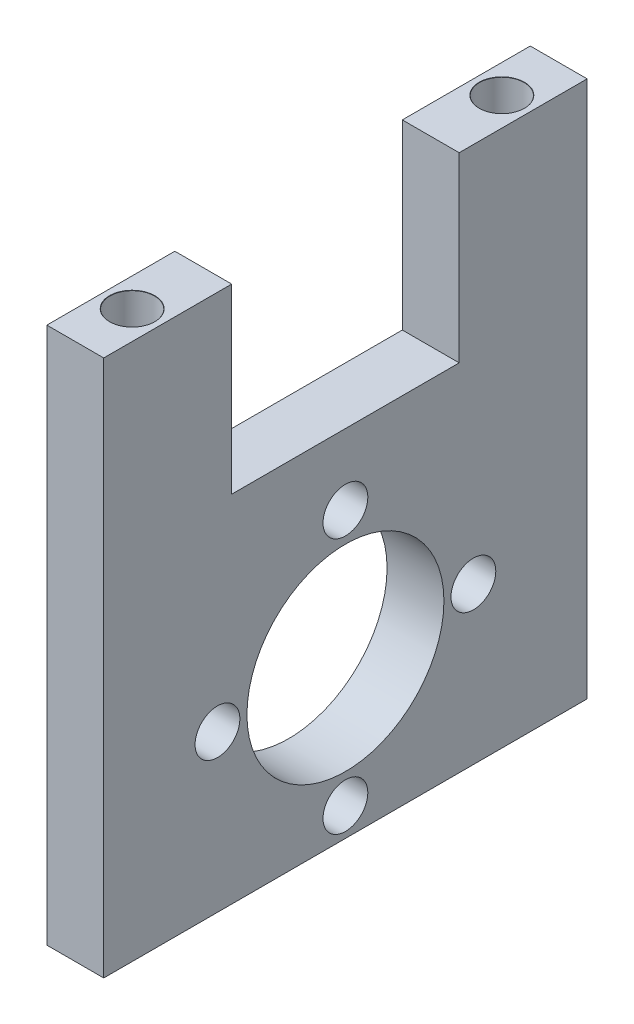
ISO-10303-21;
HEADER;
FILE_DESCRIPTION(('STEP AP214'),'2;1');
FILE_NAME('part.step','',(''),(''),'','','');
FILE_SCHEMA(('AUTOMOTIVE_DESIGN { 1 0 10303 214 1 1 1 1 }'));
ENDSEC;
DATA;
#1=APPLICATION_CONTEXT('core data for automotive mechanical design processes');
#2=APPLICATION_PROTOCOL_DEFINITION('international standard','automotive_design',2000,#1);
#3=PRODUCT_CONTEXT('',#1,'mechanical');
#4=PRODUCT('Part','Part','',(#3));
#5=PRODUCT_RELATED_PRODUCT_CATEGORY('part','',(#4));
#6=PRODUCT_DEFINITION_FORMATION('','',#4);
#7=PRODUCT_DEFINITION_CONTEXT('part definition',#1,'design');
#8=PRODUCT_DEFINITION('design','',#6,#7);
#9=PRODUCT_DEFINITION_SHAPE('','',#8);
#10=(LENGTH_UNIT() NAMED_UNIT(*) SI_UNIT(.MILLI.,.METRE.));
#11=(NAMED_UNIT(*) PLANE_ANGLE_UNIT() SI_UNIT($,.RADIAN.));
#12=(NAMED_UNIT(*) SI_UNIT($,.STERADIAN.) SOLID_ANGLE_UNIT());
#13=UNCERTAINTY_MEASURE_WITH_UNIT(LENGTH_MEASURE(1.E-05),#10,'distance_accuracy_value','');
#14=(GEOMETRIC_REPRESENTATION_CONTEXT(3) GLOBAL_UNCERTAINTY_ASSIGNED_CONTEXT((#13)) GLOBAL_UNIT_ASSIGNED_CONTEXT((#10,
#11,#12)) REPRESENTATION_CONTEXT('',''));
#15=CARTESIAN_POINT('',(0.,0.,0.));
#16=DIRECTION('',(0.,0.,1.));
#17=DIRECTION('',(1.,0.,0.));
#18=AXIS2_PLACEMENT_3D('',#15,#16,#17);
#19=CARTESIAN_POINT('',(193.219917581196,76.2,0.));
#20=DIRECTION('',(0.,-1.,0.));
#21=DIRECTION('',(0.,0.,-1.));
#22=AXIS2_PLACEMENT_3D('',#19,#20,#21);
#23=PLANE('',#22);
#24=DIRECTION('',(0.,0.,-1.));
#25=VECTOR('',#24,1.);
#26=CARTESIAN_POINT('',(199.569917581196,76.2,0.));
#27=LINE('',#26,#25);
#28=CARTESIAN_POINT('',(199.569917581196,76.2,-88.9));
#29=VERTEX_POINT('',#28);
#30=CARTESIAN_POINT('',(199.569917581196,76.2,-114.3));
#31=VERTEX_POINT('',#30);
#32=EDGE_CURVE('E223',#29,#31,#27,.T.);
#33=ORIENTED_EDGE('',*,*,#32,.T.);
#34=DIRECTION('',(1.,0.,0.));
#35=VECTOR('',#34,1.);
#36=CARTESIAN_POINT('',(193.219917581196,76.2,-114.3));
#37=LINE('',#36,#35);
#38=CARTESIAN_POINT('',(193.219917581196,76.2,-114.3));
#39=VERTEX_POINT('',#38);
#40=EDGE_CURVE('E11',#39,#31,#37,.T.);
#41=ORIENTED_EDGE('',*,*,#40,.F.);
#42=DIRECTION('',(0.,0.,-1.));
#43=VECTOR('',#42,1.);
#44=CARTESIAN_POINT('',(193.219917581196,76.2,0.));
#45=LINE('',#44,#43);
#46=CARTESIAN_POINT('',(193.219917581196,76.2,-88.9));
#47=VERTEX_POINT('',#46);
#48=EDGE_CURVE('E66',#47,#39,#45,.T.);
#49=ORIENTED_EDGE('',*,*,#48,.F.);
#50=DIRECTION('',(1.,0.,0.));
#51=VECTOR('',#50,1.);
#52=CARTESIAN_POINT('',(193.219917581196,76.2,-88.9));
#53=LINE('',#52,#51);
#54=EDGE_CURVE('E143',#47,#29,#53,.T.);
#55=ORIENTED_EDGE('',*,*,#54,.T.);
#56=EDGE_LOOP('',(#33,#41,#49,#55));
#57=FACE_BOUND('',#56,.T.);
#58=ADVANCED_FACE('F47',(#57),#23,.F.);
#59=CARTESIAN_POINT('',(193.219917581196,0.,-114.3));
#60=DIRECTION('',(0.,0.,1.));
#61=DIRECTION('',(1.,0.,0.));
#62=AXIS2_PLACEMENT_3D('',#59,#60,#61);
#63=PLANE('',#62);
#64=DIRECTION('',(0.,-1.,0.));
#65=VECTOR('',#64,1.);
#66=CARTESIAN_POINT('',(199.569917581196,0.,-114.3));
#67=LINE('',#66,#65);
#68=CARTESIAN_POINT('',(199.569917581196,96.52,-114.3));
#69=VERTEX_POINT('',#68);
#70=EDGE_CURVE('E156',#69,#31,#67,.T.);
#71=ORIENTED_EDGE('',*,*,#70,.F.);
#72=DIRECTION('',(1.,0.,0.));
#73=VECTOR('',#72,1.);
#74=CARTESIAN_POINT('',(193.219917581196,96.52,-114.3));
#75=LINE('',#74,#73);
#76=CARTESIAN_POINT('',(193.219917581196,96.52,-114.3));
#77=VERTEX_POINT('',#76);
#78=EDGE_CURVE('E57',#77,#69,#75,.T.);
#79=ORIENTED_EDGE('',*,*,#78,.F.);
#80=DIRECTION('',(0.,-1.,0.));
#81=VECTOR('',#80,1.);
#82=CARTESIAN_POINT('',(193.219917581196,0.,-114.3));
#83=LINE('',#82,#81);
#84=EDGE_CURVE('E140',#77,#39,#83,.T.);
#85=ORIENTED_EDGE('',*,*,#84,.T.);
#86=ORIENTED_EDGE('',*,*,#40,.T.);
#87=EDGE_LOOP('',(#71,#79,#85,#86));
#88=FACE_BOUND('',#87,.T.);
#89=ADVANCED_FACE('F282',(#88),#63,.T.);
#90=CARTESIAN_POINT('',(193.219917581196,96.52,0.));
#91=DIRECTION('',(0.,1.,0.));
#92=DIRECTION('',(0.,0.,1.));
#93=AXIS2_PLACEMENT_3D('',#90,#91,#92);
#94=PLANE('',#93);
#95=CARTESIAN_POINT('',(196.394917581196,96.52,-122.2375));
#96=DIRECTION('',(0.,1.,0.));
#97=DIRECTION('',(0.,0.,1.));
#98=AXIS2_PLACEMENT_3D('',#95,#96,#97);
#99=CIRCLE('',#98,2.525);
#100=CARTESIAN_POINT('',(196.394917581196,96.52,-119.7125));
#101=VERTEX_POINT('',#100);
#102=EDGE_CURVE('E190',#101,#101,#99,.T.);
#103=ORIENTED_EDGE('',*,*,#102,.F.);
#104=EDGE_LOOP('',(#103));
#105=FACE_BOUND('',#104,.T.);
#106=DIRECTION('',(0.,0.,1.));
#107=VECTOR('',#106,1.);
#108=CARTESIAN_POINT('',(199.569917581196,96.52,0.));
#109=LINE('',#108,#107);
#110=CARTESIAN_POINT('',(199.569917581196,96.52,-128.5875));
#111=VERTEX_POINT('',#110);
#112=EDGE_CURVE('E127',#111,#69,#109,.T.);
#113=ORIENTED_EDGE('',*,*,#112,.F.);
#114=DIRECTION('',(1.,0.,0.));
#115=VECTOR('',#114,1.);
#116=CARTESIAN_POINT('',(193.219917581196,96.52,-128.5875));
#117=LINE('',#116,#115);
#118=CARTESIAN_POINT('',(193.219917581196,96.52,-128.5875));
#119=VERTEX_POINT('',#118);
#120=EDGE_CURVE('E122',#119,#111,#117,.T.);
#121=ORIENTED_EDGE('',*,*,#120,.F.);
#122=DIRECTION('',(0.,0.,1.));
#123=VECTOR('',#122,1.);
#124=CARTESIAN_POINT('',(193.219917581196,96.52,0.));
#125=LINE('',#124,#123);
#126=EDGE_CURVE('E126',#119,#77,#125,.T.);
#127=ORIENTED_EDGE('',*,*,#126,.T.);
#128=ORIENTED_EDGE('',*,*,#78,.T.);
#129=EDGE_LOOP('',(#113,#121,#127,#128));
#130=FACE_BOUND('',#129,.T.);
#131=ADVANCED_FACE('F124',(#105,#130),#94,.T.);
#132=CARTESIAN_POINT('',(193.219917581196,0.,-128.5875));
#133=DIRECTION('',(0.,0.,1.));
#134=DIRECTION('',(1.,0.,0.));
#135=AXIS2_PLACEMENT_3D('',#132,#133,#134);
#136=PLANE('',#135);
#137=DIRECTION('',(0.,-1.,0.));
#138=VECTOR('',#137,1.);
#139=CARTESIAN_POINT('',(199.569917581196,0.,-128.5875));
#140=LINE('',#139,#138);
#141=CARTESIAN_POINT('',(199.569917581196,36.5632999999999,-128.5875));
#142=VERTEX_POINT('',#141);
#143=EDGE_CURVE('E225',#111,#142,#140,.T.);
#144=ORIENTED_EDGE('',*,*,#143,.T.);
#145=DIRECTION('',(1.,0.,0.));
#146=VECTOR('',#145,1.);
#147=CARTESIAN_POINT('',(193.219917581196,36.5632999999999,-128.5875));
#148=LINE('',#147,#146);
#149=CARTESIAN_POINT('',(193.219917581196,36.5632999999999,-128.5875));
#150=VERTEX_POINT('',#149);
#151=EDGE_CURVE('E130',#150,#142,#148,.T.);
#152=ORIENTED_EDGE('',*,*,#151,.F.);
#153=DIRECTION('',(0.,-1.,0.));
#154=VECTOR('',#153,1.);
#155=CARTESIAN_POINT('',(193.219917581196,0.,-128.5875));
#156=LINE('',#155,#154);
#157=EDGE_CURVE('E133',#119,#150,#156,.T.);
#158=ORIENTED_EDGE('',*,*,#157,.F.);
#159=ORIENTED_EDGE('',*,*,#120,.T.);
#160=EDGE_LOOP('',(#144,#152,#158,#159));
#161=FACE_BOUND('',#160,.T.);
#162=ADVANCED_FACE('F134',(#161),#136,.F.);
#163=CARTESIAN_POINT('',(193.219917581196,36.5632999999999,0.));
#164=DIRECTION('',(0.,1.,0.));
#165=DIRECTION('',(0.,0.,1.));
#166=AXIS2_PLACEMENT_3D('',#163,#164,#165);
#167=PLANE('',#166);
#168=DIRECTION('',(0.,0.,1.));
#169=VECTOR('',#168,1.);
#170=CARTESIAN_POINT('',(199.569917581196,36.5632999999999,0.));
#171=LINE('',#170,#169);
#172=CARTESIAN_POINT('',(199.569917581196,36.5632999999999,-74.6125));
#173=VERTEX_POINT('',#172);
#174=EDGE_CURVE('E221',#142,#173,#171,.T.);
#175=ORIENTED_EDGE('',*,*,#174,.T.);
#176=DIRECTION('',(1.,0.,0.));
#177=VECTOR('',#176,1.);
#178=CARTESIAN_POINT('',(193.219917581196,36.5632999999999,-74.6125));
#179=LINE('',#178,#177);
#180=CARTESIAN_POINT('',(193.219917581196,36.5632999999999,-74.6125));
#181=VERTEX_POINT('',#180);
#182=EDGE_CURVE('E234',#181,#173,#179,.T.);
#183=ORIENTED_EDGE('',*,*,#182,.F.);
#184=DIRECTION('',(0.,0.,1.));
#185=VECTOR('',#184,1.);
#186=CARTESIAN_POINT('',(193.219917581196,36.5632999999999,0.));
#187=LINE('',#186,#185);
#188=EDGE_CURVE('E137',#150,#181,#187,.T.);
#189=ORIENTED_EDGE('',*,*,#188,.F.);
#190=ORIENTED_EDGE('',*,*,#151,.T.);
#191=EDGE_LOOP('',(#175,#183,#189,#190));
#192=FACE_BOUND('',#191,.T.);
#193=ADVANCED_FACE('F270',(#192),#167,.F.);
#194=CARTESIAN_POINT('',(193.219917581196,0.,-74.6125));
#195=DIRECTION('',(0.,0.,1.));
#196=DIRECTION('',(1.,0.,0.));
#197=AXIS2_PLACEMENT_3D('',#194,#195,#196);
#198=PLANE('',#197);
#199=DIRECTION('',(0.,-1.,0.));
#200=VECTOR('',#199,1.);
#201=CARTESIAN_POINT('',(199.569917581196,0.,-74.6125));
#202=LINE('',#201,#200);
#203=CARTESIAN_POINT('',(199.569917581196,96.52,-74.6125));
#204=VERTEX_POINT('',#203);
#205=EDGE_CURVE('E218',#204,#173,#202,.T.);
#206=ORIENTED_EDGE('',*,*,#205,.F.);
#207=DIRECTION('',(1.,0.,0.));
#208=VECTOR('',#207,1.);
#209=CARTESIAN_POINT('',(193.219917581196,96.52,-74.6125));
#210=LINE('',#209,#208);
#211=CARTESIAN_POINT('',(193.219917581196,96.52,-74.6125));
#212=VERTEX_POINT('',#211);
#213=EDGE_CURVE('E213',#212,#204,#210,.T.);
#214=ORIENTED_EDGE('',*,*,#213,.F.);
#215=DIRECTION('',(0.,-1.,0.));
#216=VECTOR('',#215,1.);
#217=CARTESIAN_POINT('',(193.219917581196,0.,-74.6125));
#218=LINE('',#217,#216);
#219=EDGE_CURVE('E148',#212,#181,#218,.T.);
#220=ORIENTED_EDGE('',*,*,#219,.T.);
#221=ORIENTED_EDGE('',*,*,#182,.T.);
#222=EDGE_LOOP('',(#206,#214,#220,#221));
#223=FACE_BOUND('',#222,.T.);
#224=ADVANCED_FACE('F207',(#223),#198,.T.);
#225=CARTESIAN_POINT('',(196.394917581196,96.52,-80.9625));
#226=DIRECTION('',(0.,1.,0.));
#227=DIRECTION('',(0.,0.,1.));
#228=AXIS2_PLACEMENT_3D('',#225,#226,#227);
#229=CIRCLE('',#228,2.525);
#230=CARTESIAN_POINT('',(196.394917581196,96.52,-78.4375));
#231=VERTEX_POINT('',#230);
#232=EDGE_CURVE('E199',#231,#231,#229,.T.);
#233=ORIENTED_EDGE('',*,*,#232,.F.);
#234=EDGE_LOOP('',(#233));
#235=FACE_BOUND('',#234,.T.);
#236=CARTESIAN_POINT('',(199.569917581196,96.52,-88.9));
#237=VERTEX_POINT('',#236);
#238=EDGE_CURVE('E211',#237,#204,#109,.T.);
#239=ORIENTED_EDGE('',*,*,#238,.F.);
#240=DIRECTION('',(1.,0.,0.));
#241=VECTOR('',#240,1.);
#242=CARTESIAN_POINT('',(193.219917581196,96.52,-88.9));
#243=LINE('',#242,#241);
#244=CARTESIAN_POINT('',(193.219917581196,96.52,-88.9));
#245=VERTEX_POINT('',#244);
#246=EDGE_CURVE('E212',#245,#237,#243,.T.);
#247=ORIENTED_EDGE('',*,*,#246,.F.);
#248=EDGE_CURVE('E142',#245,#212,#125,.T.);
#249=ORIENTED_EDGE('',*,*,#248,.T.);
#250=ORIENTED_EDGE('',*,*,#213,.T.);
#251=EDGE_LOOP('',(#239,#247,#249,#250));
#252=FACE_BOUND('',#251,.T.);
#253=ADVANCED_FACE('F205',(#235,#252),#94,.T.);
#254=CARTESIAN_POINT('',(193.219917581196,54.0257999999999,-101.6));
#255=DIRECTION('',(1.,0.,0.));
#256=DIRECTION('',(0.,0.,-1.));
#257=AXIS2_PLACEMENT_3D('',#254,#255,#256);
#258=CYLINDRICAL_SURFACE('',#257,10.9982);
#259=CARTESIAN_POINT('',(193.219917581196,54.0257999999999,-101.6));
#260=DIRECTION('',(1.,0.,0.));
#261=DIRECTION('',(0.,0.,-1.));
#262=AXIS2_PLACEMENT_3D('',#259,#260,#261);
#263=CIRCLE('',#262,10.9982);
#264=CARTESIAN_POINT('',(193.219917581196,54.0257999999999,-112.5982));
#265=VERTEX_POINT('',#264);
#266=EDGE_CURVE('E151',#265,#265,#263,.T.);
#267=ORIENTED_EDGE('',*,*,#266,.F.);
#268=EDGE_LOOP('',(#267));
#269=FACE_BOUND('',#268,.T.);
#270=CARTESIAN_POINT('',(199.569917581196,54.0257999999999,-101.6));
#271=DIRECTION('',(1.,0.,0.));
#272=DIRECTION('',(0.,0.,-1.));
#273=AXIS2_PLACEMENT_3D('',#270,#271,#272);
#274=CIRCLE('',#273,10.9982);
#275=CARTESIAN_POINT('',(199.569917581196,54.0257999999999,-112.5982));
#276=VERTEX_POINT('',#275);
#277=EDGE_CURVE('E242',#276,#276,#274,.T.);
#278=ORIENTED_EDGE('',*,*,#277,.T.);
#279=EDGE_LOOP('',(#278));
#280=FACE_BOUND('',#279,.T.);
#281=ADVANCED_FACE('F49',(#269,#280),#258,.F.);
#282=CARTESIAN_POINT('',(193.219917581196,0.,-88.9));
#283=DIRECTION('',(0.,0.,1.));
#284=DIRECTION('',(1.,0.,0.));
#285=AXIS2_PLACEMENT_3D('',#282,#283,#284);
#286=PLANE('',#285);
#287=DIRECTION('',(0.,-1.,0.));
#288=VECTOR('',#287,1.);
#289=CARTESIAN_POINT('',(199.569917581196,0.,-88.9));
#290=LINE('',#289,#288);
#291=EDGE_CURVE('E219',#237,#29,#290,.T.);
#292=ORIENTED_EDGE('',*,*,#291,.T.);
#293=ORIENTED_EDGE('',*,*,#54,.F.);
#294=DIRECTION('',(0.,-1.,0.));
#295=VECTOR('',#294,1.);
#296=CARTESIAN_POINT('',(193.219917581196,0.,-88.9));
#297=LINE('',#296,#295);
#298=EDGE_CURVE('E106',#245,#47,#297,.T.);
#299=ORIENTED_EDGE('',*,*,#298,.F.);
#300=ORIENTED_EDGE('',*,*,#246,.T.);
#301=EDGE_LOOP('',(#292,#293,#299,#300));
#302=FACE_BOUND('',#301,.T.);
#303=ADVANCED_FACE('F287',(#302),#286,.F.);
#304=CARTESIAN_POINT('',(193.219917581196,0.,0.));
#305=DIRECTION('',(1.,0.,0.));
#306=DIRECTION('',(0.,0.,-1.));
#307=AXIS2_PLACEMENT_3D('',#304,#305,#306);
#308=PLANE('',#307);
#309=CARTESIAN_POINT('',(193.219917581196,68.3132999999999,-101.6));
#310=DIRECTION('',(-1.,0.,0.));
#311=DIRECTION('',(0.,0.,1.));
#312=AXIS2_PLACEMENT_3D('',#309,#310,#311);
#313=CIRCLE('',#312,2.525);
#314=CARTESIAN_POINT('',(193.219917581196,68.3132999999999,-99.075));
#315=VERTEX_POINT('',#314);
#316=EDGE_CURVE('E181',#315,#315,#313,.T.);
#317=ORIENTED_EDGE('',*,*,#316,.F.);
#318=EDGE_LOOP('',(#317));
#319=FACE_BOUND('',#318,.T.);
#320=CARTESIAN_POINT('',(193.219917581196,54.0257999999999,-87.3125));
#321=DIRECTION('',(-1.,0.,0.));
#322=DIRECTION('',(0.,0.,1.));
#323=AXIS2_PLACEMENT_3D('',#320,#321,#322);
#324=CIRCLE('',#323,2.525);
#325=CARTESIAN_POINT('',(193.219917581196,54.0257999999999,-84.7875));
#326=VERTEX_POINT('',#325);
#327=EDGE_CURVE('E175',#326,#326,#324,.T.);
#328=ORIENTED_EDGE('',*,*,#327,.F.);
#329=EDGE_LOOP('',(#328));
#330=FACE_BOUND('',#329,.T.);
#331=CARTESIAN_POINT('',(193.219917581196,39.7382999999999,-101.6));
#332=DIRECTION('',(-1.,0.,0.));
#333=DIRECTION('',(0.,0.,1.));
#334=AXIS2_PLACEMENT_3D('',#331,#332,#333);
#335=CIRCLE('',#334,2.525);
#336=CARTESIAN_POINT('',(193.219917581196,39.7382999999999,-99.075));
#337=VERTEX_POINT('',#336);
#338=EDGE_CURVE('E168',#337,#337,#335,.T.);
#339=ORIENTED_EDGE('',*,*,#338,.F.);
#340=EDGE_LOOP('',(#339));
#341=FACE_BOUND('',#340,.T.);
#342=CARTESIAN_POINT('',(193.219917581196,54.0257999999999,-115.8875));
#343=DIRECTION('',(-1.,0.,0.));
#344=DIRECTION('',(0.,0.,1.));
#345=AXIS2_PLACEMENT_3D('',#342,#343,#344);
#346=CIRCLE('',#345,2.525);
#347=CARTESIAN_POINT('',(193.219917581196,54.0257999999999,-113.3625));
#348=VERTEX_POINT('',#347);
#349=EDGE_CURVE('E161',#348,#348,#346,.T.);
#350=ORIENTED_EDGE('',*,*,#349,.F.);
#351=EDGE_LOOP('',(#350));
#352=FACE_BOUND('',#351,.T.);
#353=ORIENTED_EDGE('',*,*,#266,.T.);
#354=EDGE_LOOP('',(#353));
#355=FACE_BOUND('',#354,.T.);
#356=ORIENTED_EDGE('',*,*,#48,.T.);
#357=ORIENTED_EDGE('',*,*,#84,.F.);
#358=ORIENTED_EDGE('',*,*,#126,.F.);
#359=ORIENTED_EDGE('',*,*,#157,.T.);
#360=ORIENTED_EDGE('',*,*,#188,.T.);
#361=ORIENTED_EDGE('',*,*,#219,.F.);
#362=ORIENTED_EDGE('',*,*,#248,.F.);
#363=ORIENTED_EDGE('',*,*,#298,.T.);
#364=EDGE_LOOP('',(#356,#357,#358,#359,#360,#361,#362,#363));
#365=FACE_BOUND('',#364,.T.);
#366=ADVANCED_FACE('F139',(#319,#330,#341,#352,#355,#365),#308,.F.);
#367=CARTESIAN_POINT('',(199.569917581196,0.,0.));
#368=DIRECTION('',(1.,0.,0.));
#369=DIRECTION('',(0.,0.,-1.));
#370=AXIS2_PLACEMENT_3D('',#367,#368,#369);
#371=PLANE('',#370);
#372=CARTESIAN_POINT('',(199.569917581196,68.3132999999999,-101.6));
#373=DIRECTION('',(1.,0.,0.));
#374=DIRECTION('',(0.,0.,-1.));
#375=AXIS2_PLACEMENT_3D('',#372,#373,#374);
#376=CIRCLE('',#375,2.49999999999999);
#377=CARTESIAN_POINT('',(199.569917581196,68.3132999999999,-104.1));
#378=VERTEX_POINT('',#377);
#379=EDGE_CURVE('E51',#378,#378,#376,.T.);
#380=ORIENTED_EDGE('',*,*,#379,.F.);
#381=EDGE_LOOP('',(#380));
#382=FACE_BOUND('',#381,.T.);
#383=CARTESIAN_POINT('',(199.569917581196,54.0257999999999,-87.3125));
#384=DIRECTION('',(1.,0.,0.));
#385=DIRECTION('',(0.,0.,-1.));
#386=AXIS2_PLACEMENT_3D('',#383,#384,#385);
#387=CIRCLE('',#386,2.49999999999999);
#388=CARTESIAN_POINT('',(199.569917581196,54.0257999999999,-89.8125));
#389=VERTEX_POINT('',#388);
#390=EDGE_CURVE('E171',#389,#389,#387,.T.);
#391=ORIENTED_EDGE('',*,*,#390,.F.);
#392=EDGE_LOOP('',(#391));
#393=FACE_BOUND('',#392,.T.);
#394=CARTESIAN_POINT('',(199.569917581196,39.7382999999999,-101.6));
#395=DIRECTION('',(1.,0.,0.));
#396=DIRECTION('',(0.,0.,-1.));
#397=AXIS2_PLACEMENT_3D('',#394,#395,#396);
#398=CIRCLE('',#397,2.49999999999999);
#399=CARTESIAN_POINT('',(199.569917581196,39.7382999999999,-104.1));
#400=VERTEX_POINT('',#399);
#401=EDGE_CURVE('E164',#400,#400,#398,.T.);
#402=ORIENTED_EDGE('',*,*,#401,.F.);
#403=EDGE_LOOP('',(#402));
#404=FACE_BOUND('',#403,.T.);
#405=CARTESIAN_POINT('',(199.569917581196,54.0257999999999,-115.8875));
#406=DIRECTION('',(1.,0.,0.));
#407=DIRECTION('',(0.,0.,-1.));
#408=AXIS2_PLACEMENT_3D('',#405,#406,#407);
#409=CIRCLE('',#408,2.49999999999999);
#410=CARTESIAN_POINT('',(199.569917581196,54.0257999999999,-118.3875));
#411=VERTEX_POINT('',#410);
#412=EDGE_CURVE('E160',#411,#411,#409,.T.);
#413=ORIENTED_EDGE('',*,*,#412,.F.);
#414=EDGE_LOOP('',(#413));
#415=FACE_BOUND('',#414,.T.);
#416=ORIENTED_EDGE('',*,*,#277,.F.);
#417=EDGE_LOOP('',(#416));
#418=FACE_BOUND('',#417,.T.);
#419=ORIENTED_EDGE('',*,*,#32,.F.);
#420=ORIENTED_EDGE('',*,*,#291,.F.);
#421=ORIENTED_EDGE('',*,*,#238,.T.);
#422=ORIENTED_EDGE('',*,*,#205,.T.);
#423=ORIENTED_EDGE('',*,*,#174,.F.);
#424=ORIENTED_EDGE('',*,*,#143,.F.);
#425=ORIENTED_EDGE('',*,*,#112,.T.);
#426=ORIENTED_EDGE('',*,*,#70,.T.);
#427=EDGE_LOOP('',(#419,#420,#421,#422,#423,#424,#425,#426));
#428=FACE_BOUND('',#427,.T.);
#429=ADVANCED_FACE('F250',(#382,#393,#404,#415,#418,#428),#371,.T.);
#430=CARTESIAN_POINT('',(193.219917581196,54.0257999999999,-115.8875));
#431=DIRECTION('',(-1.,0.,0.));
#432=DIRECTION('',(0.,0.,1.));
#433=AXIS2_PLACEMENT_3D('',#430,#431,#432);
#434=CYLINDRICAL_SURFACE('',#433,2.49999999999999);
#435=ORIENTED_EDGE('',*,*,#412,.T.);
#436=EDGE_LOOP('',(#435));
#437=FACE_BOUND('',#436,.T.);
#438=CARTESIAN_POINT('',(193.244917581196,54.0257999999999,-115.8875));
#439=DIRECTION('',(-1.,0.,0.));
#440=DIRECTION('',(0.,0.,1.));
#441=AXIS2_PLACEMENT_3D('',#438,#439,#440);
#442=CIRCLE('',#441,2.49999999999999);
#443=CARTESIAN_POINT('',(193.244917581196,54.0257999999999,-113.3875));
#444=VERTEX_POINT('',#443);
#445=EDGE_CURVE('E157',#444,#444,#442,.T.);
#446=ORIENTED_EDGE('',*,*,#445,.T.);
#447=EDGE_LOOP('',(#446));
#448=FACE_BOUND('',#447,.T.);
#449=ADVANCED_FACE('F253',(#437,#448),#434,.F.);
#450=CARTESIAN_POINT('',(193.219917581196,54.0257999999999,-115.8875));
#451=DIRECTION('',(-1.,0.,0.));
#452=DIRECTION('',(0.,0.,1.));
#453=AXIS2_PLACEMENT_3D('',#450,#451,#452);
#454=CONICAL_SURFACE('',#453,2.525,0.785398163397726);
#455=ORIENTED_EDGE('',*,*,#445,.F.);
#456=EDGE_LOOP('',(#455));
#457=FACE_BOUND('',#456,.T.);
#458=ORIENTED_EDGE('',*,*,#349,.T.);
#459=EDGE_LOOP('',(#458));
#460=FACE_BOUND('',#459,.T.);
#461=ADVANCED_FACE('F331',(#457,#460),#454,.F.);
#462=CARTESIAN_POINT('',(193.219917581196,39.7382999999999,-101.6));
#463=DIRECTION('',(-1.,0.,0.));
#464=DIRECTION('',(0.,0.,1.));
#465=AXIS2_PLACEMENT_3D('',#462,#463,#464);
#466=CYLINDRICAL_SURFACE('',#465,2.49999999999999);
#467=ORIENTED_EDGE('',*,*,#401,.T.);
#468=EDGE_LOOP('',(#467));
#469=FACE_BOUND('',#468,.T.);
#470=CARTESIAN_POINT('',(193.244917581196,39.7382999999999,-101.6));
#471=DIRECTION('',(-1.,0.,0.));
#472=DIRECTION('',(0.,0.,1.));
#473=AXIS2_PLACEMENT_3D('',#470,#471,#472);
#474=CIRCLE('',#473,2.49999999999999);
#475=CARTESIAN_POINT('',(193.244917581196,39.7382999999999,-99.1));
#476=VERTEX_POINT('',#475);
#477=EDGE_CURVE('E165',#476,#476,#474,.T.);
#478=ORIENTED_EDGE('',*,*,#477,.T.);
#479=EDGE_LOOP('',(#478));
#480=FACE_BOUND('',#479,.T.);
#481=ADVANCED_FACE('F341',(#469,#480),#466,.F.);
#482=CARTESIAN_POINT('',(193.219917581196,39.7382999999999,-101.6));
#483=DIRECTION('',(-1.,0.,0.));
#484=DIRECTION('',(0.,0.,1.));
#485=AXIS2_PLACEMENT_3D('',#482,#483,#484);
#486=CONICAL_SURFACE('',#485,2.525,0.785398163397726);
#487=ORIENTED_EDGE('',*,*,#477,.F.);
#488=EDGE_LOOP('',(#487));
#489=FACE_BOUND('',#488,.T.);
#490=ORIENTED_EDGE('',*,*,#338,.T.);
#491=EDGE_LOOP('',(#490));
#492=FACE_BOUND('',#491,.T.);
#493=ADVANCED_FACE('F351',(#489,#492),#486,.F.);
#494=CARTESIAN_POINT('',(193.219917581196,54.0257999999999,-87.3125));
#495=DIRECTION('',(-1.,0.,0.));
#496=DIRECTION('',(0.,0.,1.));
#497=AXIS2_PLACEMENT_3D('',#494,#495,#496);
#498=CYLINDRICAL_SURFACE('',#497,2.49999999999999);
#499=ORIENTED_EDGE('',*,*,#390,.T.);
#500=EDGE_LOOP('',(#499));
#501=FACE_BOUND('',#500,.T.);
#502=CARTESIAN_POINT('',(193.244917581196,54.0257999999999,-87.3125));
#503=DIRECTION('',(-1.,0.,0.));
#504=DIRECTION('',(0.,0.,1.));
#505=AXIS2_PLACEMENT_3D('',#502,#503,#504);
#506=CIRCLE('',#505,2.49999999999999);
#507=CARTESIAN_POINT('',(193.244917581196,54.0257999999999,-84.8125));
#508=VERTEX_POINT('',#507);
#509=EDGE_CURVE('E172',#508,#508,#506,.T.);
#510=ORIENTED_EDGE('',*,*,#509,.T.);
#511=EDGE_LOOP('',(#510));
#512=FACE_BOUND('',#511,.T.);
#513=ADVANCED_FACE('F247',(#501,#512),#498,.F.);
#514=CARTESIAN_POINT('',(193.219917581196,54.0257999999999,-87.3125));
#515=DIRECTION('',(-1.,0.,0.));
#516=DIRECTION('',(0.,0.,1.));
#517=AXIS2_PLACEMENT_3D('',#514,#515,#516);
#518=CONICAL_SURFACE('',#517,2.525,0.785398163397726);
#519=ORIENTED_EDGE('',*,*,#509,.F.);
#520=EDGE_LOOP('',(#519));
#521=FACE_BOUND('',#520,.T.);
#522=ORIENTED_EDGE('',*,*,#327,.T.);
#523=EDGE_LOOP('',(#522));
#524=FACE_BOUND('',#523,.T.);
#525=ADVANCED_FACE('F370',(#521,#524),#518,.F.);
#526=CARTESIAN_POINT('',(193.219917581196,68.3132999999999,-101.6));
#527=DIRECTION('',(-1.,0.,0.));
#528=DIRECTION('',(0.,0.,1.));
#529=AXIS2_PLACEMENT_3D('',#526,#527,#528);
#530=CYLINDRICAL_SURFACE('',#529,2.49999999999999);
#531=ORIENTED_EDGE('',*,*,#379,.T.);
#532=EDGE_LOOP('',(#531));
#533=FACE_BOUND('',#532,.T.);
#534=CARTESIAN_POINT('',(193.244917581196,68.3132999999999,-101.6));
#535=DIRECTION('',(-1.,0.,0.));
#536=DIRECTION('',(0.,0.,1.));
#537=AXIS2_PLACEMENT_3D('',#534,#535,#536);
#538=CIRCLE('',#537,2.49999999999999);
#539=CARTESIAN_POINT('',(193.244917581196,68.3132999999999,-99.1));
#540=VERTEX_POINT('',#539);
#541=EDGE_CURVE('E178',#540,#540,#538,.T.);
#542=ORIENTED_EDGE('',*,*,#541,.T.);
#543=EDGE_LOOP('',(#542));
#544=FACE_BOUND('',#543,.T.);
#545=ADVANCED_FACE('F379',(#533,#544),#530,.F.);
#546=CARTESIAN_POINT('',(193.219917581196,68.3132999999999,-101.6));
#547=DIRECTION('',(-1.,0.,0.));
#548=DIRECTION('',(0.,0.,1.));
#549=AXIS2_PLACEMENT_3D('',#546,#547,#548);
#550=CONICAL_SURFACE('',#549,2.525,0.785398163397726);
#551=ORIENTED_EDGE('',*,*,#541,.F.);
#552=EDGE_LOOP('',(#551));
#553=FACE_BOUND('',#552,.T.);
#554=ORIENTED_EDGE('',*,*,#316,.T.);
#555=EDGE_LOOP('',(#554));
#556=FACE_BOUND('',#555,.T.);
#557=ADVANCED_FACE('F389',(#553,#556),#550,.F.);
#558=CARTESIAN_POINT('',(196.394917581196,71.12,-122.2375));
#559=DIRECTION('',(0.,1.,0.));
#560=DIRECTION('',(0.,0.,1.));
#561=AXIS2_PLACEMENT_3D('',#558,#559,#560);
#562=CONICAL_SURFACE('',#561,2.49999999999997,1.02974425867665);
#563=CARTESIAN_POINT('',(196.394917581196,69.6178484524311,-122.2375));
#564=VERTEX_POINT('',#563);
#565=VERTEX_LOOP('',#564);
#566=FACE_BOUND('',#565,.T.);
#567=CARTESIAN_POINT('',(196.394917581196,71.12,-122.2375));
#568=DIRECTION('',(0.,1.,0.));
#569=DIRECTION('',(0.,0.,1.));
#570=AXIS2_PLACEMENT_3D('',#567,#568,#569);
#571=CIRCLE('',#570,2.49999999999997);
#572=CARTESIAN_POINT('',(196.394917581196,71.12,-119.7375));
#573=VERTEX_POINT('',#572);
#574=EDGE_CURVE('E184',#573,#573,#571,.T.);
#575=ORIENTED_EDGE('',*,*,#574,.T.);
#576=EDGE_LOOP('',(#575));
#577=FACE_BOUND('',#576,.T.);
#578=ADVANCED_FACE('F399',(#566,#577),#562,.F.);
#579=CARTESIAN_POINT('',(196.394917581196,96.52,-122.2375));
#580=DIRECTION('',(0.,1.,0.));
#581=DIRECTION('',(0.,0.,1.));
#582=AXIS2_PLACEMENT_3D('',#579,#580,#581);
#583=CYLINDRICAL_SURFACE('',#582,2.49999999999999);
#584=ORIENTED_EDGE('',*,*,#574,.F.);
#585=EDGE_LOOP('',(#584));
#586=FACE_BOUND('',#585,.T.);
#587=CARTESIAN_POINT('',(196.394917581196,96.495,-122.2375));
#588=DIRECTION('',(0.,1.,0.));
#589=DIRECTION('',(0.,0.,1.));
#590=AXIS2_PLACEMENT_3D('',#587,#588,#589);
#591=CIRCLE('',#590,2.5);
#592=CARTESIAN_POINT('',(196.394917581196,96.495,-119.7375));
#593=VERTEX_POINT('',#592);
#594=EDGE_CURVE('E187',#593,#593,#591,.T.);
#595=ORIENTED_EDGE('',*,*,#594,.T.);
#596=EDGE_LOOP('',(#595));
#597=FACE_BOUND('',#596,.T.);
#598=ADVANCED_FACE('F410',(#586,#597),#583,.F.);
#599=CARTESIAN_POINT('',(196.394917581196,96.52,-122.2375));
#600=DIRECTION('',(0.,1.,0.));
#601=DIRECTION('',(0.,0.,1.));
#602=AXIS2_PLACEMENT_3D('',#599,#600,#601);
#603=CONICAL_SURFACE('',#602,2.525,0.785398163397171);
#604=ORIENTED_EDGE('',*,*,#594,.F.);
#605=EDGE_LOOP('',(#604));
#606=FACE_BOUND('',#605,.T.);
#607=ORIENTED_EDGE('',*,*,#102,.T.);
#608=EDGE_LOOP('',(#607));
#609=FACE_BOUND('',#608,.T.);
#610=ADVANCED_FACE('F420',(#606,#609),#603,.F.);
#611=CARTESIAN_POINT('',(196.394917581196,71.12,-80.9625));
#612=DIRECTION('',(0.,1.,0.));
#613=DIRECTION('',(0.,0.,1.));
#614=AXIS2_PLACEMENT_3D('',#611,#612,#613);
#615=CONICAL_SURFACE('',#614,2.49999999999997,1.02974425867665);
#616=CARTESIAN_POINT('',(196.394917581196,69.6178484524311,-80.9625));
#617=VERTEX_POINT('',#616);
#618=VERTEX_LOOP('',#617);
#619=FACE_BOUND('',#618,.T.);
#620=CARTESIAN_POINT('',(196.394917581196,71.12,-80.9625));
#621=DIRECTION('',(0.,1.,0.));
#622=DIRECTION('',(0.,0.,1.));
#623=AXIS2_PLACEMENT_3D('',#620,#621,#622);
#624=CIRCLE('',#623,2.49999999999997);
#625=CARTESIAN_POINT('',(196.394917581196,71.12,-78.4625));
#626=VERTEX_POINT('',#625);
#627=EDGE_CURVE('E193',#626,#626,#624,.T.);
#628=ORIENTED_EDGE('',*,*,#627,.T.);
#629=EDGE_LOOP('',(#628));
#630=FACE_BOUND('',#629,.T.);
#631=ADVANCED_FACE('F430',(#619,#630),#615,.F.);
#632=CARTESIAN_POINT('',(196.394917581196,96.52,-80.9625));
#633=DIRECTION('',(0.,1.,0.));
#634=DIRECTION('',(0.,0.,1.));
#635=AXIS2_PLACEMENT_3D('',#632,#633,#634);
#636=CYLINDRICAL_SURFACE('',#635,2.49999999999999);
#637=ORIENTED_EDGE('',*,*,#627,.F.);
#638=EDGE_LOOP('',(#637));
#639=FACE_BOUND('',#638,.T.);
#640=CARTESIAN_POINT('',(196.394917581196,96.495,-80.9625));
#641=DIRECTION('',(0.,1.,0.));
#642=DIRECTION('',(0.,0.,1.));
#643=AXIS2_PLACEMENT_3D('',#640,#641,#642);
#644=CIRCLE('',#643,2.5);
#645=CARTESIAN_POINT('',(196.394917581196,96.495,-78.4625));
#646=VERTEX_POINT('',#645);
#647=EDGE_CURVE('E196',#646,#646,#644,.T.);
#648=ORIENTED_EDGE('',*,*,#647,.T.);
#649=EDGE_LOOP('',(#648));
#650=FACE_BOUND('',#649,.T.);
#651=ADVANCED_FACE('F440',(#639,#650),#636,.F.);
#652=CARTESIAN_POINT('',(196.394917581196,96.52,-80.9625));
#653=DIRECTION('',(0.,1.,0.));
#654=DIRECTION('',(0.,0.,1.));
#655=AXIS2_PLACEMENT_3D('',#652,#653,#654);
#656=CONICAL_SURFACE('',#655,2.525,0.785398163397171);
#657=ORIENTED_EDGE('',*,*,#647,.F.);
#658=EDGE_LOOP('',(#657));
#659=FACE_BOUND('',#658,.T.);
#660=ORIENTED_EDGE('',*,*,#232,.T.);
#661=EDGE_LOOP('',(#660));
#662=FACE_BOUND('',#661,.T.);
#663=ADVANCED_FACE('F203',(#659,#662),#656,.F.);
#664=CLOSED_SHELL('',(#58,#89,#131,#162,#193,#224,#253,#281,#303,#366,#429,#449,#461,#481,#493,
#513,#525,#545,#557,#578,#598,#610,#631,#651,#663));
#665=MANIFOLD_SOLID_BREP('B2',#664);
#666=ADVANCED_BREP_SHAPE_REPRESENTATION('',(#18,#665),#14);
#667=SHAPE_DEFINITION_REPRESENTATION(#9,#666);
ENDSEC;
END-ISO-10303-21;
